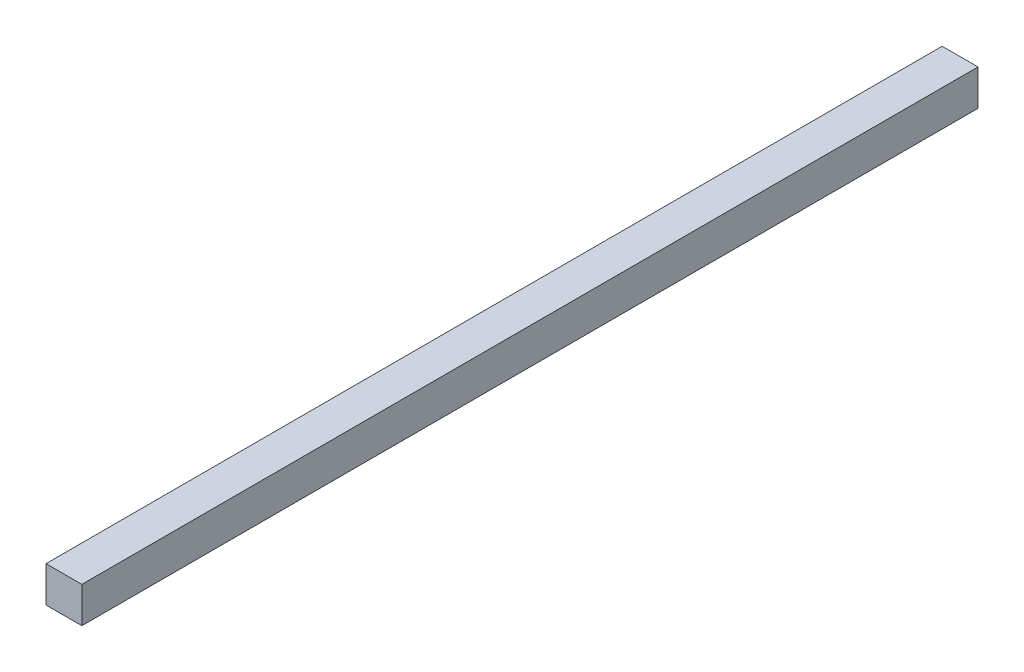
ISO-10303-21;
HEADER;
FILE_DESCRIPTION(('STEP AP214'),'2;1');
FILE_NAME('part.step','',(''),(''),'','','');
FILE_SCHEMA(('AUTOMOTIVE_DESIGN { 1 0 10303 214 1 1 1 1 }'));
ENDSEC;
DATA;
#1=APPLICATION_CONTEXT('core data for automotive mechanical design processes');
#2=APPLICATION_PROTOCOL_DEFINITION('international standard','automotive_design',2000,#1);
#3=PRODUCT_CONTEXT('',#1,'mechanical');
#4=PRODUCT('Part','Part','',(#3));
#5=PRODUCT_RELATED_PRODUCT_CATEGORY('part','',(#4));
#6=PRODUCT_DEFINITION_FORMATION('','',#4);
#7=PRODUCT_DEFINITION_CONTEXT('part definition',#1,'design');
#8=PRODUCT_DEFINITION('design','',#6,#7);
#9=PRODUCT_DEFINITION_SHAPE('','',#8);
#10=(LENGTH_UNIT() NAMED_UNIT(*) SI_UNIT(.MILLI.,.METRE.));
#11=(NAMED_UNIT(*) PLANE_ANGLE_UNIT() SI_UNIT($,.RADIAN.));
#12=(NAMED_UNIT(*) SI_UNIT($,.STERADIAN.) SOLID_ANGLE_UNIT());
#13=UNCERTAINTY_MEASURE_WITH_UNIT(LENGTH_MEASURE(1.E-05),#10,'distance_accuracy_value','');
#14=(GEOMETRIC_REPRESENTATION_CONTEXT(3) GLOBAL_UNCERTAINTY_ASSIGNED_CONTEXT((#13)) GLOBAL_UNIT_ASSIGNED_CONTEXT((#10,
#11,#12)) REPRESENTATION_CONTEXT('',''));
#15=CARTESIAN_POINT('',(0.,0.,0.));
#16=DIRECTION('',(0.,0.,1.));
#17=DIRECTION('',(1.,0.,0.));
#18=AXIS2_PLACEMENT_3D('',#15,#16,#17);
#19=CARTESIAN_POINT('',(10.,10.,500.));
#20=DIRECTION('',(-1.,0.,0.));
#21=DIRECTION('',(0.,-1.,0.));
#22=AXIS2_PLACEMENT_3D('',#19,#20,#21);
#23=PLANE('',#22);
#24=DIRECTION('',(0.,1.,0.));
#25=VECTOR('',#24,1.);
#26=CARTESIAN_POINT('',(10.,10.,0.));
#27=LINE('',#26,#25);
#28=CARTESIAN_POINT('',(10.,-10.,0.));
#29=VERTEX_POINT('',#28);
#30=CARTESIAN_POINT('',(10.,10.,0.));
#31=VERTEX_POINT('',#30);
#32=EDGE_CURVE('E98',#29,#31,#27,.T.);
#33=ORIENTED_EDGE('',*,*,#32,.T.);
#34=DIRECTION('',(0.,0.,-1.));
#35=VECTOR('',#34,1.);
#36=CARTESIAN_POINT('',(10.,10.,500.));
#37=LINE('',#36,#35);
#38=CARTESIAN_POINT('',(10.,10.,500.));
#39=VERTEX_POINT('',#38);
#40=EDGE_CURVE('E11',#39,#31,#37,.T.);
#41=ORIENTED_EDGE('',*,*,#40,.F.);
#42=DIRECTION('',(0.,1.,0.));
#43=VECTOR('',#42,1.);
#44=CARTESIAN_POINT('',(10.,10.,500.));
#45=LINE('',#44,#43);
#46=CARTESIAN_POINT('',(10.,-10.,500.));
#47=VERTEX_POINT('',#46);
#48=EDGE_CURVE('E86',#47,#39,#45,.T.);
#49=ORIENTED_EDGE('',*,*,#48,.F.);
#50=DIRECTION('',(0.,0.,-1.));
#51=VECTOR('',#50,1.);
#52=CARTESIAN_POINT('',(10.,-10.,500.));
#53=LINE('',#52,#51);
#54=EDGE_CURVE('E94',#47,#29,#53,.T.);
#55=ORIENTED_EDGE('',*,*,#54,.T.);
#56=EDGE_LOOP('',(#33,#41,#49,#55));
#57=FACE_BOUND('',#56,.T.);
#58=ADVANCED_FACE('F35',(#57),#23,.F.);
#59=CARTESIAN_POINT('',(-10.,10.,500.));
#60=DIRECTION('',(0.,-1.,0.));
#61=DIRECTION('',(0.,0.,-1.));
#62=AXIS2_PLACEMENT_3D('',#59,#60,#61);
#63=PLANE('',#62);
#64=DIRECTION('',(-1.,0.,0.));
#65=VECTOR('',#64,1.);
#66=CARTESIAN_POINT('',(-10.,10.,0.));
#67=LINE('',#66,#65);
#68=CARTESIAN_POINT('',(-10.,10.,0.));
#69=VERTEX_POINT('',#68);
#70=EDGE_CURVE('E90',#31,#69,#67,.T.);
#71=ORIENTED_EDGE('',*,*,#70,.T.);
#72=DIRECTION('',(0.,0.,-1.));
#73=VECTOR('',#72,1.);
#74=CARTESIAN_POINT('',(-10.,10.,500.));
#75=LINE('',#74,#73);
#76=CARTESIAN_POINT('',(-10.,10.,500.));
#77=VERTEX_POINT('',#76);
#78=EDGE_CURVE('E43',#77,#69,#75,.T.);
#79=ORIENTED_EDGE('',*,*,#78,.F.);
#80=DIRECTION('',(-1.,0.,0.));
#81=VECTOR('',#80,1.);
#82=CARTESIAN_POINT('',(-10.,10.,500.));
#83=LINE('',#82,#81);
#84=EDGE_CURVE('E81',#39,#77,#83,.T.);
#85=ORIENTED_EDGE('',*,*,#84,.F.);
#86=ORIENTED_EDGE('',*,*,#40,.T.);
#87=EDGE_LOOP('',(#71,#79,#85,#86));
#88=FACE_BOUND('',#87,.T.);
#89=ADVANCED_FACE('F89',(#88),#63,.F.);
#90=CARTESIAN_POINT('',(-10.,10.,500.));
#91=DIRECTION('',(1.,0.,0.));
#92=DIRECTION('',(0.,1.,0.));
#93=AXIS2_PLACEMENT_3D('',#90,#91,#92);
#94=PLANE('',#93);
#95=DIRECTION('',(0.,-1.,0.));
#96=VECTOR('',#95,1.);
#97=CARTESIAN_POINT('',(-10.,10.,0.));
#98=LINE('',#97,#96);
#99=CARTESIAN_POINT('',(-10.,-10.,0.));
#100=VERTEX_POINT('',#99);
#101=EDGE_CURVE('E68',#69,#100,#98,.T.);
#102=ORIENTED_EDGE('',*,*,#101,.T.);
#103=DIRECTION('',(0.,0.,-1.));
#104=VECTOR('',#103,1.);
#105=CARTESIAN_POINT('',(-10.,-10.,500.));
#106=LINE('',#105,#104);
#107=CARTESIAN_POINT('',(-10.,-10.,500.));
#108=VERTEX_POINT('',#107);
#109=EDGE_CURVE('E91',#108,#100,#106,.T.);
#110=ORIENTED_EDGE('',*,*,#109,.F.);
#111=DIRECTION('',(0.,-1.,0.));
#112=VECTOR('',#111,1.);
#113=CARTESIAN_POINT('',(-10.,10.,500.));
#114=LINE('',#113,#112);
#115=EDGE_CURVE('E84',#77,#108,#114,.T.);
#116=ORIENTED_EDGE('',*,*,#115,.F.);
#117=ORIENTED_EDGE('',*,*,#78,.T.);
#118=EDGE_LOOP('',(#102,#110,#116,#117));
#119=FACE_BOUND('',#118,.T.);
#120=ADVANCED_FACE('F92',(#119),#94,.F.);
#121=CARTESIAN_POINT('',(-10.,-10.,500.));
#122=DIRECTION('',(0.,1.,0.));
#123=DIRECTION('',(0.,0.,1.));
#124=AXIS2_PLACEMENT_3D('',#121,#122,#123);
#125=PLANE('',#124);
#126=DIRECTION('',(1.,0.,0.));
#127=VECTOR('',#126,1.);
#128=CARTESIAN_POINT('',(-10.,-10.,0.));
#129=LINE('',#128,#127);
#130=EDGE_CURVE('E74',#100,#29,#129,.T.);
#131=ORIENTED_EDGE('',*,*,#130,.T.);
#132=ORIENTED_EDGE('',*,*,#54,.F.);
#133=DIRECTION('',(1.,0.,0.));
#134=VECTOR('',#133,1.);
#135=CARTESIAN_POINT('',(-10.,-10.,500.));
#136=LINE('',#135,#134);
#137=EDGE_CURVE('E51',#108,#47,#136,.T.);
#138=ORIENTED_EDGE('',*,*,#137,.F.);
#139=ORIENTED_EDGE('',*,*,#109,.T.);
#140=EDGE_LOOP('',(#131,#132,#138,#139));
#141=FACE_BOUND('',#140,.T.);
#142=ADVANCED_FACE('F105',(#141),#125,.F.);
#143=CARTESIAN_POINT('',(0.,0.,500.));
#144=DIRECTION('',(0.,0.,1.));
#145=DIRECTION('',(1.,0.,0.));
#146=AXIS2_PLACEMENT_3D('',#143,#144,#145);
#147=PLANE('',#146);
#148=ORIENTED_EDGE('',*,*,#48,.T.);
#149=ORIENTED_EDGE('',*,*,#84,.T.);
#150=ORIENTED_EDGE('',*,*,#115,.T.);
#151=ORIENTED_EDGE('',*,*,#137,.T.);
#152=EDGE_LOOP('',(#148,#149,#150,#151));
#153=FACE_BOUND('',#152,.T.);
#154=ADVANCED_FACE('F82',(#153),#147,.T.);
#155=CARTESIAN_POINT('',(0.,0.,0.));
#156=DIRECTION('',(0.,0.,1.));
#157=DIRECTION('',(1.,0.,0.));
#158=AXIS2_PLACEMENT_3D('',#155,#156,#157);
#159=PLANE('',#158);
#160=ORIENTED_EDGE('',*,*,#32,.F.);
#161=ORIENTED_EDGE('',*,*,#130,.F.);
#162=ORIENTED_EDGE('',*,*,#101,.F.);
#163=ORIENTED_EDGE('',*,*,#70,.F.);
#164=EDGE_LOOP('',(#160,#161,#162,#163));
#165=FACE_BOUND('',#164,.T.);
#166=ADVANCED_FACE('F108',(#165),#159,.F.);
#167=CLOSED_SHELL('',(#58,#89,#120,#142,#154,#166));
#168=MANIFOLD_SOLID_BREP('B2',#167);
#169=ADVANCED_BREP_SHAPE_REPRESENTATION('',(#18,#168),#14);
#170=SHAPE_DEFINITION_REPRESENTATION(#9,#169);
ENDSEC;
END-ISO-10303-21;
